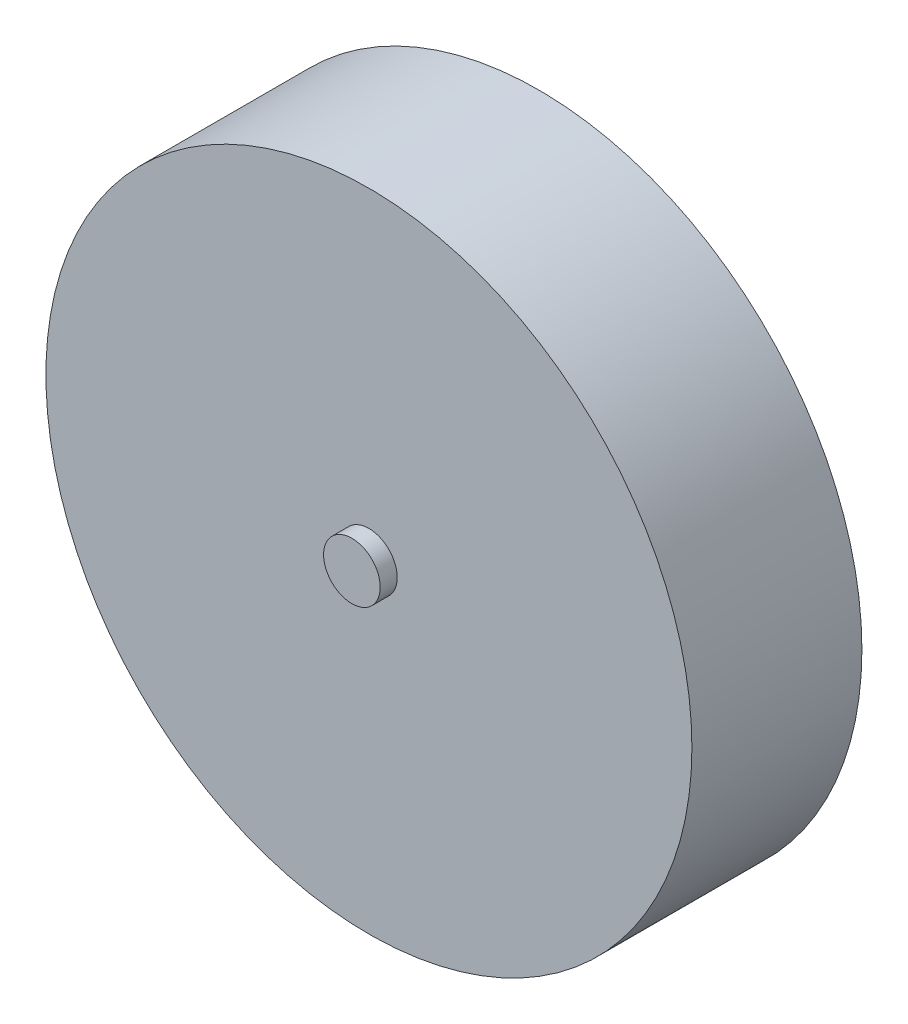
ISO-10303-21;
HEADER;
FILE_DESCRIPTION(('STEP AP214'),'2;1');
FILE_NAME('part.step','',(''),(''),'','','');
FILE_SCHEMA(('AUTOMOTIVE_DESIGN { 1 0 10303 214 1 1 1 1 }'));
ENDSEC;
DATA;
#1=APPLICATION_CONTEXT('core data for automotive mechanical design processes');
#2=APPLICATION_PROTOCOL_DEFINITION('international standard','automotive_design',2000,#1);
#3=PRODUCT_CONTEXT('',#1,'mechanical');
#4=PRODUCT('Part','Part','',(#3));
#5=PRODUCT_RELATED_PRODUCT_CATEGORY('part','',(#4));
#6=PRODUCT_DEFINITION_FORMATION('','',#4);
#7=PRODUCT_DEFINITION_CONTEXT('part definition',#1,'design');
#8=PRODUCT_DEFINITION('design','',#6,#7);
#9=PRODUCT_DEFINITION_SHAPE('','',#8);
#10=(LENGTH_UNIT() NAMED_UNIT(*) SI_UNIT(.MILLI.,.METRE.));
#11=(NAMED_UNIT(*) PLANE_ANGLE_UNIT() SI_UNIT($,.RADIAN.));
#12=(NAMED_UNIT(*) SI_UNIT($,.STERADIAN.) SOLID_ANGLE_UNIT());
#13=UNCERTAINTY_MEASURE_WITH_UNIT(LENGTH_MEASURE(1.E-05),#10,'distance_accuracy_value','');
#14=(GEOMETRIC_REPRESENTATION_CONTEXT(3) GLOBAL_UNCERTAINTY_ASSIGNED_CONTEXT((#13)) GLOBAL_UNIT_ASSIGNED_CONTEXT((#10,
#11,#12)) REPRESENTATION_CONTEXT('',''));
#15=CARTESIAN_POINT('',(0.,0.,0.));
#16=DIRECTION('',(0.,0.,1.));
#17=DIRECTION('',(1.,0.,0.));
#18=AXIS2_PLACEMENT_3D('',#15,#16,#17);
#19=CARTESIAN_POINT('',(0.,0.,1.5));
#20=DIRECTION('',(0.,0.,-1.));
#21=DIRECTION('',(-1.,0.,0.));
#22=AXIS2_PLACEMENT_3D('',#19,#20,#21);
#23=CYLINDRICAL_SURFACE('',#22,2.85);
#24=CARTESIAN_POINT('',(0.,0.,1.5));
#25=DIRECTION('',(0.,0.,1.));
#26=DIRECTION('',(1.,0.,0.));
#27=AXIS2_PLACEMENT_3D('',#24,#25,#26);
#28=CIRCLE('',#27,2.85);
#29=CARTESIAN_POINT('',(2.85,0.,1.5));
#30=VERTEX_POINT('',#29);
#31=EDGE_CURVE('E10',#30,#30,#28,.T.);
#32=ORIENTED_EDGE('',*,*,#31,.F.);
#33=EDGE_LOOP('',(#32));
#34=FACE_BOUND('',#33,.T.);
#35=CARTESIAN_POINT('',(0.,0.,0.));
#36=DIRECTION('',(0.,0.,1.));
#37=DIRECTION('',(1.,0.,0.));
#38=AXIS2_PLACEMENT_3D('',#35,#36,#37);
#39=CIRCLE('',#38,2.85);
#40=CARTESIAN_POINT('',(2.85,0.,0.));
#41=VERTEX_POINT('',#40);
#42=EDGE_CURVE('E34',#41,#41,#39,.T.);
#43=ORIENTED_EDGE('',*,*,#42,.T.);
#44=EDGE_LOOP('',(#43));
#45=FACE_BOUND('',#44,.T.);
#46=ADVANCED_FACE('F31',(#34,#45),#23,.T.);
#47=CARTESIAN_POINT('',(0.,0.,1.5));
#48=DIRECTION('',(0.,0.,1.));
#49=DIRECTION('',(1.,0.,0.));
#50=AXIS2_PLACEMENT_3D('',#47,#48,#49);
#51=PLANE('',#50);
#52=CARTESIAN_POINT('',(0.,0.,1.5));
#53=DIRECTION('',(0.,0.,1.));
#54=DIRECTION('',(1.,0.,0.));
#55=AXIS2_PLACEMENT_3D('',#52,#53,#54);
#56=CIRCLE('',#55,0.25);
#57=CARTESIAN_POINT('',(0.25,0.,1.5));
#58=VERTEX_POINT('',#57);
#59=EDGE_CURVE('E43',#58,#58,#56,.T.);
#60=ORIENTED_EDGE('',*,*,#59,.F.);
#61=EDGE_LOOP('',(#60));
#62=FACE_BOUND('',#61,.T.);
#63=ORIENTED_EDGE('',*,*,#31,.T.);
#64=EDGE_LOOP('',(#63));
#65=FACE_BOUND('',#64,.T.);
#66=ADVANCED_FACE('F58',(#62,#65),#51,.T.);
#67=CARTESIAN_POINT('',(0.,0.,0.));
#68=DIRECTION('',(0.,0.,1.));
#69=DIRECTION('',(1.,0.,0.));
#70=AXIS2_PLACEMENT_3D('',#67,#68,#69);
#71=PLANE('',#70);
#72=ORIENTED_EDGE('',*,*,#42,.F.);
#73=EDGE_LOOP('',(#72));
#74=FACE_BOUND('',#73,.T.);
#75=ADVANCED_FACE('F54',(#74),#71,.F.);
#76=CARTESIAN_POINT('',(0.,0.,1.65));
#77=DIRECTION('',(0.,0.,-1.));
#78=DIRECTION('',(-1.,0.,0.));
#79=AXIS2_PLACEMENT_3D('',#76,#77,#78);
#80=CYLINDRICAL_SURFACE('',#79,0.25);
#81=CARTESIAN_POINT('',(0.,0.,1.65));
#82=DIRECTION('',(0.,0.,1.));
#83=DIRECTION('',(1.,0.,0.));
#84=AXIS2_PLACEMENT_3D('',#81,#82,#83);
#85=CIRCLE('',#84,0.25);
#86=CARTESIAN_POINT('',(0.25,0.,1.65));
#87=VERTEX_POINT('',#86);
#88=EDGE_CURVE('E41',#87,#87,#85,.T.);
#89=ORIENTED_EDGE('',*,*,#88,.F.);
#90=EDGE_LOOP('',(#89));
#91=FACE_BOUND('',#90,.T.);
#92=ORIENTED_EDGE('',*,*,#59,.T.);
#93=EDGE_LOOP('',(#92));
#94=FACE_BOUND('',#93,.T.);
#95=ADVANCED_FACE('F51',(#91,#94),#80,.T.);
#96=CARTESIAN_POINT('',(0.,0.,1.65));
#97=DIRECTION('',(0.,0.,1.));
#98=DIRECTION('',(1.,0.,0.));
#99=AXIS2_PLACEMENT_3D('',#96,#97,#98);
#100=PLANE('',#99);
#101=ORIENTED_EDGE('',*,*,#88,.T.);
#102=EDGE_LOOP('',(#101));
#103=FACE_BOUND('',#102,.T.);
#104=ADVANCED_FACE('F49',(#103),#100,.T.);
#105=CLOSED_SHELL('',(#46,#66,#75,#95,#104));
#106=MANIFOLD_SOLID_BREP('B2',#105);
#107=ADVANCED_BREP_SHAPE_REPRESENTATION('',(#18,#106),#14);
#108=SHAPE_DEFINITION_REPRESENTATION(#9,#107);
ENDSEC;
END-ISO-10303-21;
